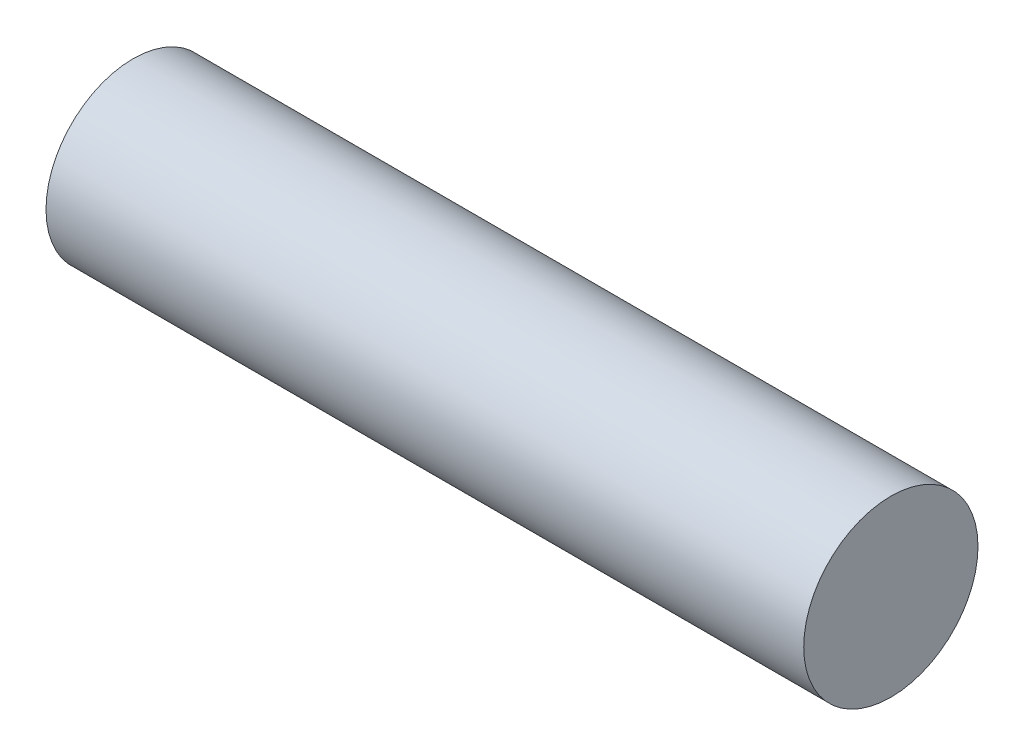
ISO-10303-21;
HEADER;
FILE_DESCRIPTION(('STEP AP214'),'2;1');
FILE_NAME('part.step','',(''),(''),'','','');
FILE_SCHEMA(('AUTOMOTIVE_DESIGN { 1 0 10303 214 1 1 1 1 }'));
ENDSEC;
DATA;
#1=APPLICATION_CONTEXT('core data for automotive mechanical design processes');
#2=APPLICATION_PROTOCOL_DEFINITION('international standard','automotive_design',2000,#1);
#3=PRODUCT_CONTEXT('',#1,'mechanical');
#4=PRODUCT('Part','Part','',(#3));
#5=PRODUCT_RELATED_PRODUCT_CATEGORY('part','',(#4));
#6=PRODUCT_DEFINITION_FORMATION('','',#4);
#7=PRODUCT_DEFINITION_CONTEXT('part definition',#1,'design');
#8=PRODUCT_DEFINITION('design','',#6,#7);
#9=PRODUCT_DEFINITION_SHAPE('','',#8);
#10=(LENGTH_UNIT() NAMED_UNIT(*) SI_UNIT(.MILLI.,.METRE.));
#11=(NAMED_UNIT(*) PLANE_ANGLE_UNIT() SI_UNIT($,.RADIAN.));
#12=(NAMED_UNIT(*) SI_UNIT($,.STERADIAN.) SOLID_ANGLE_UNIT());
#13=UNCERTAINTY_MEASURE_WITH_UNIT(LENGTH_MEASURE(1.E-05),#10,'distance_accuracy_value','');
#14=(GEOMETRIC_REPRESENTATION_CONTEXT(3) GLOBAL_UNCERTAINTY_ASSIGNED_CONTEXT((#13)) GLOBAL_UNIT_ASSIGNED_CONTEXT((#10,
#11,#12)) REPRESENTATION_CONTEXT('',''));
#15=CARTESIAN_POINT('',(0.,0.,0.));
#16=DIRECTION('',(0.,0.,1.));
#17=DIRECTION('',(1.,0.,0.));
#18=AXIS2_PLACEMENT_3D('',#15,#16,#17);
#19=CARTESIAN_POINT('',(12.7,0.,0.));
#20=DIRECTION('',(-1.,0.,0.));
#21=DIRECTION('',(0.,0.,1.));
#22=AXIS2_PLACEMENT_3D('',#19,#20,#21);
#23=CYLINDRICAL_SURFACE('',#22,1.4605);
#24=CARTESIAN_POINT('',(12.7,0.,0.));
#25=DIRECTION('',(1.,0.,0.));
#26=DIRECTION('',(0.,0.,-1.));
#27=AXIS2_PLACEMENT_3D('',#24,#25,#26);
#28=CIRCLE('',#27,1.4605);
#29=CARTESIAN_POINT('',(12.7,0.,-1.4605));
#30=VERTEX_POINT('',#29);
#31=EDGE_CURVE('E10',#30,#30,#28,.T.);
#32=ORIENTED_EDGE('',*,*,#31,.F.);
#33=EDGE_LOOP('',(#32));
#34=FACE_BOUND('',#33,.T.);
#35=CARTESIAN_POINT('',(0.,0.,0.));
#36=DIRECTION('',(1.,0.,0.));
#37=DIRECTION('',(0.,0.,-1.));
#38=AXIS2_PLACEMENT_3D('',#35,#36,#37);
#39=CIRCLE('',#38,1.4605);
#40=CARTESIAN_POINT('',(0.,0.,-1.4605));
#41=VERTEX_POINT('',#40);
#42=EDGE_CURVE('E37',#41,#41,#39,.T.);
#43=ORIENTED_EDGE('',*,*,#42,.T.);
#44=EDGE_LOOP('',(#43));
#45=FACE_BOUND('',#44,.T.);
#46=ADVANCED_FACE('F40',(#34,#45),#23,.T.);
#47=CARTESIAN_POINT('',(12.7,0.,0.));
#48=DIRECTION('',(1.,0.,0.));
#49=DIRECTION('',(0.,0.,-1.));
#50=AXIS2_PLACEMENT_3D('',#47,#48,#49);
#51=PLANE('',#50);
#52=ORIENTED_EDGE('',*,*,#31,.T.);
#53=EDGE_LOOP('',(#52));
#54=FACE_BOUND('',#53,.T.);
#55=ADVANCED_FACE('F55',(#54),#51,.T.);
#56=CARTESIAN_POINT('',(0.,0.,0.));
#57=DIRECTION('',(1.,0.,0.));
#58=DIRECTION('',(0.,0.,-1.));
#59=AXIS2_PLACEMENT_3D('',#56,#57,#58);
#60=PLANE('',#59);
#61=ORIENTED_EDGE('',*,*,#42,.F.);
#62=EDGE_LOOP('',(#61));
#63=FACE_BOUND('',#62,.T.);
#64=ADVANCED_FACE('F49',(#63),#60,.F.);
#65=CLOSED_SHELL('',(#46,#55,#64));
#66=MANIFOLD_SOLID_BREP('B2',#65);
#67=ADVANCED_BREP_SHAPE_REPRESENTATION('',(#18,#66),#14);
#68=SHAPE_DEFINITION_REPRESENTATION(#9,#67);
ENDSEC;
END-ISO-10303-21;
